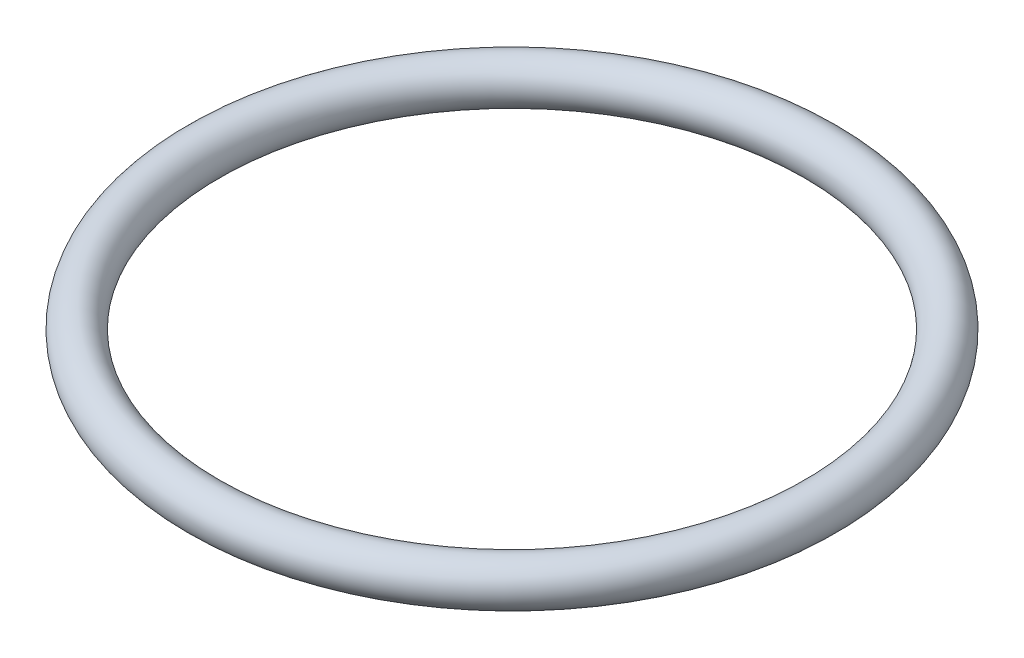
ISO-10303-21;
HEADER;
FILE_DESCRIPTION(('STEP AP214'),'2;1');
FILE_NAME('part.step','',(''),(''),'','','');
FILE_SCHEMA(('AUTOMOTIVE_DESIGN { 1 0 10303 214 1 1 1 1 }'));
ENDSEC;
DATA;
#1=APPLICATION_CONTEXT('core data for automotive mechanical design processes');
#2=APPLICATION_PROTOCOL_DEFINITION('international standard','automotive_design',2000,#1);
#3=PRODUCT_CONTEXT('',#1,'mechanical');
#4=PRODUCT('Part','Part','',(#3));
#5=PRODUCT_RELATED_PRODUCT_CATEGORY('part','',(#4));
#6=PRODUCT_DEFINITION_FORMATION('','',#4);
#7=PRODUCT_DEFINITION_CONTEXT('part definition',#1,'design');
#8=PRODUCT_DEFINITION('design','',#6,#7);
#9=PRODUCT_DEFINITION_SHAPE('','',#8);
#10=(LENGTH_UNIT() NAMED_UNIT(*) SI_UNIT(.MILLI.,.METRE.));
#11=(NAMED_UNIT(*) PLANE_ANGLE_UNIT() SI_UNIT($,.RADIAN.));
#12=(NAMED_UNIT(*) SI_UNIT($,.STERADIAN.) SOLID_ANGLE_UNIT());
#13=UNCERTAINTY_MEASURE_WITH_UNIT(LENGTH_MEASURE(1.E-05),#10,'distance_accuracy_value','');
#14=(GEOMETRIC_REPRESENTATION_CONTEXT(3) GLOBAL_UNCERTAINTY_ASSIGNED_CONTEXT((#13)) GLOBAL_UNIT_ASSIGNED_CONTEXT((#10,
#11,#12)) REPRESENTATION_CONTEXT('',''));
#15=CARTESIAN_POINT('',(0.,0.,0.));
#16=DIRECTION('',(0.,0.,1.));
#17=DIRECTION('',(1.,0.,0.));
#18=AXIS2_PLACEMENT_3D('',#15,#16,#17);
#19=CARTESIAN_POINT('',(0.,0.,0.));
#20=DIRECTION('',(0.,-1.,0.));
#21=DIRECTION('',(0.,0.,-1.));
#22=AXIS2_PLACEMENT_3D('',#19,#20,#21);
#23=TOROIDAL_SURFACE('',#22,12.75,0.9);
#24=CARTESIAN_POINT('',(0.,0.,-13.65));
#25=VERTEX_POINT('',#24);
#26=VERTEX_LOOP('',#25);
#27=FACE_BOUND('',#26,.T.);
#28=ADVANCED_FACE('F28',(#27),#23,.T.);
#29=CLOSED_SHELL('',(#28));
#30=MANIFOLD_SOLID_BREP('B2',#29);
#31=ADVANCED_BREP_SHAPE_REPRESENTATION('',(#18,#30),#14);
#32=SHAPE_DEFINITION_REPRESENTATION(#9,#31);
ENDSEC;
END-ISO-10303-21;
